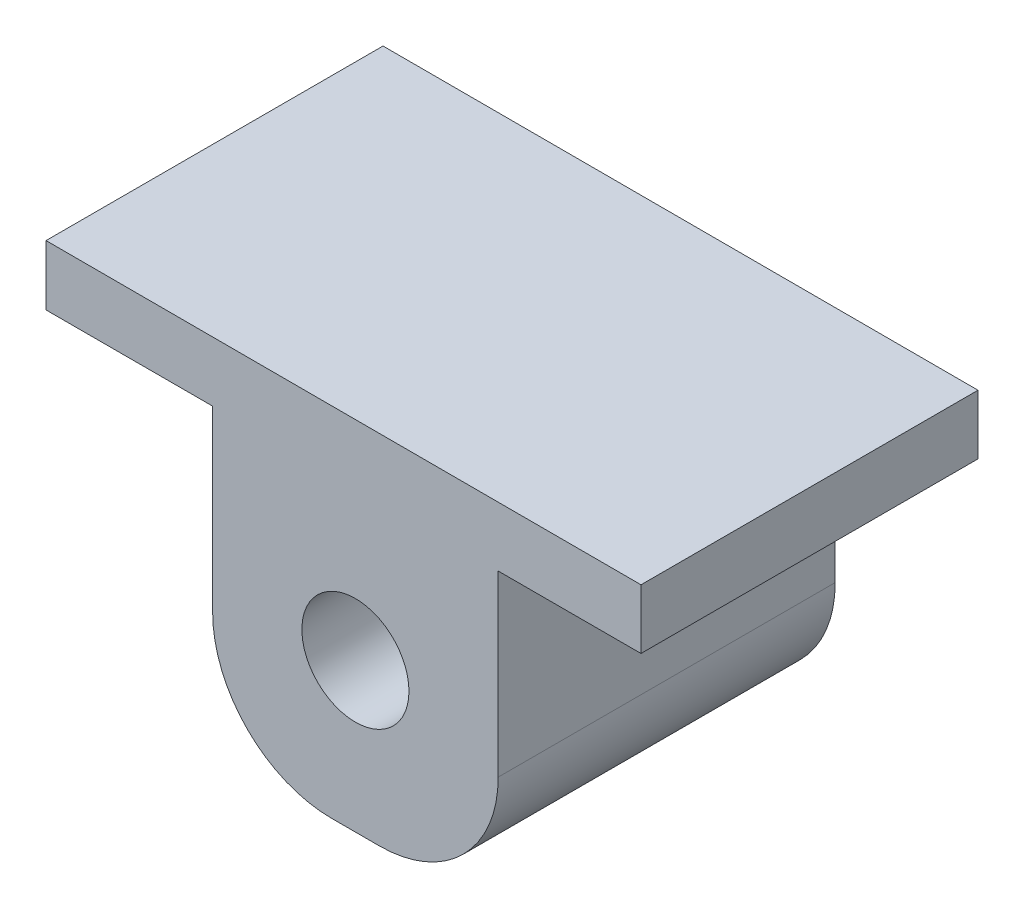
ISO-10303-21;
HEADER;
FILE_DESCRIPTION(('STEP AP214'),'2;1');
FILE_NAME('part.step','',(''),(''),'','','');
FILE_SCHEMA(('AUTOMOTIVE_DESIGN { 1 0 10303 214 1 1 1 1 }'));
ENDSEC;
DATA;
#1=APPLICATION_CONTEXT('core data for automotive mechanical design processes');
#2=APPLICATION_PROTOCOL_DEFINITION('international standard','automotive_design',2000,#1);
#3=PRODUCT_CONTEXT('',#1,'mechanical');
#4=PRODUCT('Part','Part','',(#3));
#5=PRODUCT_RELATED_PRODUCT_CATEGORY('part','',(#4));
#6=PRODUCT_DEFINITION_FORMATION('','',#4);
#7=PRODUCT_DEFINITION_CONTEXT('part definition',#1,'design');
#8=PRODUCT_DEFINITION('design','',#6,#7);
#9=PRODUCT_DEFINITION_SHAPE('','',#8);
#10=(LENGTH_UNIT() NAMED_UNIT(*) SI_UNIT(.MILLI.,.METRE.));
#11=(NAMED_UNIT(*) PLANE_ANGLE_UNIT() SI_UNIT($,.RADIAN.));
#12=(NAMED_UNIT(*) SI_UNIT($,.STERADIAN.) SOLID_ANGLE_UNIT());
#13=UNCERTAINTY_MEASURE_WITH_UNIT(LENGTH_MEASURE(1.E-05),#10,'distance_accuracy_value','');
#14=(GEOMETRIC_REPRESENTATION_CONTEXT(3) GLOBAL_UNCERTAINTY_ASSIGNED_CONTEXT((#13)) GLOBAL_UNIT_ASSIGNED_CONTEXT((#10,
#11,#12)) REPRESENTATION_CONTEXT('',''));
#15=CARTESIAN_POINT('',(0.,0.,0.));
#16=DIRECTION('',(0.,0.,1.));
#17=DIRECTION('',(1.,0.,0.));
#18=AXIS2_PLACEMENT_3D('',#15,#16,#17);
#19=CARTESIAN_POINT('',(0.,0.,28.32));
#20=DIRECTION('',(0.,0.,-1.));
#21=DIRECTION('',(-1.,0.,0.));
#22=AXIS2_PLACEMENT_3D('',#19,#20,#21);
#23=PLANE('',#22);
#24=DIRECTION('',(0.,-1.,0.));
#25=VECTOR('',#24,1.);
#26=CARTESIAN_POINT('',(14.5277983879841,-30.0449330067845,28.32));
#27=LINE('',#26,#25);
#28=CARTESIAN_POINT('',(14.5277983879841,-5.04493300678446,28.32));
#29=VERTEX_POINT('',#28);
#30=CARTESIAN_POINT('',(14.5277983879841,-20.0449330067845,28.32));
#31=VERTEX_POINT('',#30);
#32=EDGE_CURVE('E133',#29,#31,#27,.T.);
#33=ORIENTED_EDGE('',*,*,#32,.T.);
#34=CARTESIAN_POINT('',(24.5277983879841,-20.0449330067845,28.32));
#35=DIRECTION('',(0.,0.,-1.));
#36=DIRECTION('',(-1.,0.,0.));
#37=AXIS2_PLACEMENT_3D('',#34,#35,#36);
#38=CIRCLE('',#37,10.);
#39=CARTESIAN_POINT('',(24.5277983879841,-30.0449330067845,28.32));
#40=VERTEX_POINT('',#39);
#41=EDGE_CURVE('E52',#31,#40,#38,.F.);
#42=ORIENTED_EDGE('',*,*,#41,.T.);
#43=DIRECTION('',(1.,0.,0.));
#44=VECTOR('',#43,1.);
#45=CARTESIAN_POINT('',(38.5277983879841,-30.0449330067845,28.32));
#46=LINE('',#45,#44);
#47=CARTESIAN_POINT('',(28.5277983879841,-30.0449330067845,28.32));
#48=VERTEX_POINT('',#47);
#49=EDGE_CURVE('E175',#40,#48,#46,.T.);
#50=ORIENTED_EDGE('',*,*,#49,.T.);
#51=CARTESIAN_POINT('',(28.5277983879841,-20.0449330067845,28.32));
#52=DIRECTION('',(0.,0.,-1.));
#53=DIRECTION('',(-1.,0.,0.));
#54=AXIS2_PLACEMENT_3D('',#51,#52,#53);
#55=CIRCLE('',#54,10.);
#56=CARTESIAN_POINT('',(38.5277983879841,-20.0449330067845,28.32));
#57=VERTEX_POINT('',#56);
#58=EDGE_CURVE('E59',#48,#57,#55,.F.);
#59=ORIENTED_EDGE('',*,*,#58,.T.);
#60=DIRECTION('',(0.,1.,0.));
#61=VECTOR('',#60,1.);
#62=CARTESIAN_POINT('',(38.5277983879841,-5.04493300678446,28.32));
#63=LINE('',#62,#61);
#64=CARTESIAN_POINT('',(38.5277983879841,-5.04493300678446,28.32));
#65=VERTEX_POINT('',#64);
#66=EDGE_CURVE('E184',#57,#65,#63,.T.);
#67=ORIENTED_EDGE('',*,*,#66,.T.);
#68=DIRECTION('',(1.,0.,0.));
#69=VECTOR('',#68,1.);
#70=CARTESIAN_POINT('',(50.5277983879841,-5.04493300678446,28.32));
#71=LINE('',#70,#69);
#72=CARTESIAN_POINT('',(50.5277983879841,-5.04493300678446,28.32));
#73=VERTEX_POINT('',#72);
#74=EDGE_CURVE('E232',#65,#73,#71,.T.);
#75=ORIENTED_EDGE('',*,*,#74,.T.);
#76=DIRECTION('',(-5.10152156768529E-06,0.999999999986987,0.));
#77=VECTOR('',#76,1.);
#78=CARTESIAN_POINT('',(50.5277728803762,-0.0449330068495192,28.32));
#79=LINE('',#78,#77);
#80=CARTESIAN_POINT('',(50.5277728803762,-0.0449330068495192,28.32));
#81=VERTEX_POINT('',#80);
#82=EDGE_CURVE('E244',#73,#81,#79,.T.);
#83=ORIENTED_EDGE('',*,*,#82,.T.);
#84=DIRECTION('',(-0.999999489847843,0.00101010101140235,0.));
#85=VECTOR('',#84,1.);
#86=CARTESIAN_POINT('',(0.527798387984074,0.00557204372059849,28.32));
#87=LINE('',#86,#85);
#88=CARTESIAN_POINT('',(0.527798387984074,0.00557204372059849,28.32));
#89=VERTEX_POINT('',#88);
#90=EDGE_CURVE('E139',#81,#89,#87,.T.);
#91=ORIENTED_EDGE('',*,*,#90,.T.);
#92=DIRECTION('',(-0.000617965823074395,-0.999999809059103,0.));
#93=VECTOR('',#92,1.);
#94=CARTESIAN_POINT('',(0.524677347877663,-5.04493300678446,28.32));
#95=LINE('',#94,#93);
#96=CARTESIAN_POINT('',(0.524677347877663,-5.04493300678446,28.32));
#97=VERTEX_POINT('',#96);
#98=EDGE_CURVE('E134',#89,#97,#95,.T.);
#99=ORIENTED_EDGE('',*,*,#98,.T.);
#100=DIRECTION('',(1.,0.,0.));
#101=VECTOR('',#100,1.);
#102=CARTESIAN_POINT('',(14.5277983879841,-5.04493300678446,28.32));
#103=LINE('',#102,#101);
#104=EDGE_CURVE('E124',#97,#29,#103,.T.);
#105=ORIENTED_EDGE('',*,*,#104,.T.);
#106=EDGE_LOOP('',(#33,#42,#50,#59,#67,#75,#83,#91,#99,#105));
#107=FACE_BOUND('',#106,.T.);
#108=CARTESIAN_POINT('',(26.5277983879841,-17.5449330067845,28.32));
#109=DIRECTION('',(0.,0.,1.));
#110=DIRECTION('',(1.,0.,0.));
#111=AXIS2_PLACEMENT_3D('',#108,#109,#110);
#112=CIRCLE('',#111,4.5);
#113=CARTESIAN_POINT('',(31.0277983879841,-17.5449330067845,28.32));
#114=VERTEX_POINT('',#113);
#115=EDGE_CURVE('E250',#114,#114,#112,.T.);
#116=ORIENTED_EDGE('',*,*,#115,.F.);
#117=EDGE_LOOP('',(#116));
#118=FACE_BOUND('',#117,.T.);
#119=ADVANCED_FACE('F43',(#107,#118),#23,.F.);
#120=CARTESIAN_POINT('',(0.,0.,0.));
#121=DIRECTION('',(0.,0.,-1.));
#122=DIRECTION('',(-1.,0.,0.));
#123=AXIS2_PLACEMENT_3D('',#120,#121,#122);
#124=PLANE('',#123);
#125=DIRECTION('',(1.,0.,0.));
#126=VECTOR('',#125,1.);
#127=CARTESIAN_POINT('',(38.5277983879841,-30.0449330067845,0.));
#128=LINE('',#127,#126);
#129=CARTESIAN_POINT('',(24.5277983879841,-30.0449330067845,0.));
#130=VERTEX_POINT('',#129);
#131=CARTESIAN_POINT('',(28.5277983879841,-30.0449330067845,0.));
#132=VERTEX_POINT('',#131);
#133=EDGE_CURVE('E192',#130,#132,#128,.T.);
#134=ORIENTED_EDGE('',*,*,#133,.F.);
#135=CARTESIAN_POINT('',(24.5277983879841,-20.0449330067845,0.));
#136=DIRECTION('',(0.,0.,-1.));
#137=DIRECTION('',(-1.,0.,0.));
#138=AXIS2_PLACEMENT_3D('',#135,#136,#137);
#139=CIRCLE('',#138,10.);
#140=CARTESIAN_POINT('',(14.5277983879841,-20.0449330067845,0.));
#141=VERTEX_POINT('',#140);
#142=EDGE_CURVE('E166',#130,#141,#139,.T.);
#143=ORIENTED_EDGE('',*,*,#142,.T.);
#144=DIRECTION('',(0.,-1.,0.));
#145=VECTOR('',#144,1.);
#146=CARTESIAN_POINT('',(14.5277983879841,-30.0449330067845,0.));
#147=LINE('',#146,#145);
#148=CARTESIAN_POINT('',(14.5277983879841,-5.04493300678446,0.));
#149=VERTEX_POINT('',#148);
#150=EDGE_CURVE('E191',#149,#141,#147,.T.);
#151=ORIENTED_EDGE('',*,*,#150,.F.);
#152=DIRECTION('',(1.,0.,0.));
#153=VECTOR('',#152,1.);
#154=CARTESIAN_POINT('',(14.5277983879841,-5.04493300678446,0.));
#155=LINE('',#154,#153);
#156=CARTESIAN_POINT('',(0.524677347877663,-5.04493300678446,0.));
#157=VERTEX_POINT('',#156);
#158=EDGE_CURVE('E195',#157,#149,#155,.T.);
#159=ORIENTED_EDGE('',*,*,#158,.F.);
#160=DIRECTION('',(-0.000617965823074395,-0.999999809059103,0.));
#161=VECTOR('',#160,1.);
#162=CARTESIAN_POINT('',(0.524677347877663,-5.04493300678446,0.));
#163=LINE('',#162,#161);
#164=CARTESIAN_POINT('',(0.527798387984074,0.00557204372059849,0.));
#165=VERTEX_POINT('',#164);
#166=EDGE_CURVE('E148',#165,#157,#163,.T.);
#167=ORIENTED_EDGE('',*,*,#166,.F.);
#168=DIRECTION('',(-0.999999489847843,0.00101010101140235,0.));
#169=VECTOR('',#168,1.);
#170=CARTESIAN_POINT('',(0.527798387984074,0.00557204372059849,0.));
#171=LINE('',#170,#169);
#172=CARTESIAN_POINT('',(50.5277728803762,-0.0449330068495192,0.));
#173=VERTEX_POINT('',#172);
#174=EDGE_CURVE('E144',#173,#165,#171,.T.);
#175=ORIENTED_EDGE('',*,*,#174,.F.);
#176=DIRECTION('',(-5.10152156768529E-06,0.999999999986987,0.));
#177=VECTOR('',#176,1.);
#178=CARTESIAN_POINT('',(50.5277728803762,-0.0449330068495192,0.));
#179=LINE('',#178,#177);
#180=CARTESIAN_POINT('',(50.5277983879841,-5.04493300678446,0.));
#181=VERTEX_POINT('',#180);
#182=EDGE_CURVE('E209',#181,#173,#179,.T.);
#183=ORIENTED_EDGE('',*,*,#182,.F.);
#184=DIRECTION('',(1.,0.,0.));
#185=VECTOR('',#184,1.);
#186=CARTESIAN_POINT('',(50.5277983879841,-5.04493300678446,0.));
#187=LINE('',#186,#185);
#188=CARTESIAN_POINT('',(38.5277983879841,-5.04493300678446,0.));
#189=VERTEX_POINT('',#188);
#190=EDGE_CURVE('E206',#189,#181,#187,.T.);
#191=ORIENTED_EDGE('',*,*,#190,.F.);
#192=DIRECTION('',(0.,1.,0.));
#193=VECTOR('',#192,1.);
#194=CARTESIAN_POINT('',(38.5277983879841,-5.04493300678446,0.));
#195=LINE('',#194,#193);
#196=CARTESIAN_POINT('',(38.5277983879841,-20.0449330067845,0.));
#197=VERTEX_POINT('',#196);
#198=EDGE_CURVE('E199',#197,#189,#195,.T.);
#199=ORIENTED_EDGE('',*,*,#198,.F.);
#200=CARTESIAN_POINT('',(28.5277983879841,-20.0449330067845,0.));
#201=DIRECTION('',(0.,0.,-1.));
#202=DIRECTION('',(-1.,0.,0.));
#203=AXIS2_PLACEMENT_3D('',#200,#201,#202);
#204=CIRCLE('',#203,10.);
#205=EDGE_CURVE('E163',#197,#132,#204,.T.);
#206=ORIENTED_EDGE('',*,*,#205,.T.);
#207=EDGE_LOOP('',(#134,#143,#151,#159,#167,#175,#183,#191,#199,#206));
#208=FACE_BOUND('',#207,.T.);
#209=CARTESIAN_POINT('',(26.5277983879841,-17.5449330067845,0.));
#210=DIRECTION('',(0.,0.,1.));
#211=DIRECTION('',(1.,0.,0.));
#212=AXIS2_PLACEMENT_3D('',#209,#210,#211);
#213=CIRCLE('',#212,4.5);
#214=CARTESIAN_POINT('',(31.0277983879841,-17.5449330067845,0.));
#215=VERTEX_POINT('',#214);
#216=EDGE_CURVE('E253',#215,#215,#213,.T.);
#217=ORIENTED_EDGE('',*,*,#216,.T.);
#218=EDGE_LOOP('',(#217));
#219=FACE_BOUND('',#218,.T.);
#220=ADVANCED_FACE('F189',(#208,#219),#124,.T.);
#221=CARTESIAN_POINT('',(0.524677347877663,-5.04493300678446,28.32));
#222=DIRECTION('',(0.999999809059103,-0.000617965823074395,0.));
#223=DIRECTION('',(0.000617965823074395,0.999999809059103,0.));
#224=AXIS2_PLACEMENT_3D('',#221,#222,#223);
#225=PLANE('',#224);
#226=ORIENTED_EDGE('',*,*,#166,.T.);
#227=DIRECTION('',(0.,0.,-1.));
#228=VECTOR('',#227,1.);
#229=CARTESIAN_POINT('',(0.524677347877663,-5.04493300678446,28.32));
#230=LINE('',#229,#228);
#231=EDGE_CURVE('E128',#97,#157,#230,.T.);
#232=ORIENTED_EDGE('',*,*,#231,.F.);
#233=ORIENTED_EDGE('',*,*,#98,.F.);
#234=DIRECTION('',(0.,0.,-1.));
#235=VECTOR('',#234,1.);
#236=CARTESIAN_POINT('',(0.527798387984074,0.00557204372059849,28.32));
#237=LINE('',#236,#235);
#238=EDGE_CURVE('E214',#89,#165,#237,.T.);
#239=ORIENTED_EDGE('',*,*,#238,.T.);
#240=EDGE_LOOP('',(#226,#232,#233,#239));
#241=FACE_BOUND('',#240,.T.);
#242=ADVANCED_FACE('F146',(#241),#225,.F.);
#243=CARTESIAN_POINT('',(14.5277983879841,-5.04493300678446,28.32));
#244=DIRECTION('',(0.,1.,0.));
#245=DIRECTION('',(-1.,0.,0.));
#246=AXIS2_PLACEMENT_3D('',#243,#244,#245);
#247=PLANE('',#246);
#248=ORIENTED_EDGE('',*,*,#158,.T.);
#249=DIRECTION('',(0.,0.,-1.));
#250=VECTOR('',#249,1.);
#251=CARTESIAN_POINT('',(14.5277983879841,-5.04493300678446,28.32));
#252=LINE('',#251,#250);
#253=EDGE_CURVE('E131',#29,#149,#252,.T.);
#254=ORIENTED_EDGE('',*,*,#253,.F.);
#255=ORIENTED_EDGE('',*,*,#104,.F.);
#256=ORIENTED_EDGE('',*,*,#231,.T.);
#257=EDGE_LOOP('',(#248,#254,#255,#256));
#258=FACE_BOUND('',#257,.T.);
#259=ADVANCED_FACE('F126',(#258),#247,.F.);
#260=CARTESIAN_POINT('',(14.5277983879841,-30.0449330067845,28.32));
#261=DIRECTION('',(1.,0.,0.));
#262=DIRECTION('',(0.,1.,0.));
#263=AXIS2_PLACEMENT_3D('',#260,#261,#262);
#264=PLANE('',#263);
#265=ORIENTED_EDGE('',*,*,#150,.T.);
#266=DIRECTION('',(0.,0.,-1.));
#267=VECTOR('',#266,1.);
#268=CARTESIAN_POINT('',(14.5277983879841,-20.0449330067845,28.32));
#269=LINE('',#268,#267);
#270=EDGE_CURVE('E67',#141,#31,#269,.F.);
#271=ORIENTED_EDGE('',*,*,#270,.T.);
#272=ORIENTED_EDGE('',*,*,#32,.F.);
#273=ORIENTED_EDGE('',*,*,#253,.T.);
#274=EDGE_LOOP('',(#265,#271,#272,#273));
#275=FACE_BOUND('',#274,.T.);
#276=ADVANCED_FACE('F193',(#275),#264,.F.);
#277=CARTESIAN_POINT('',(38.5277983879841,-30.0449330067845,28.32));
#278=DIRECTION('',(0.,1.,0.));
#279=DIRECTION('',(-1.,0.,0.));
#280=AXIS2_PLACEMENT_3D('',#277,#278,#279);
#281=PLANE('',#280);
#282=ORIENTED_EDGE('',*,*,#49,.F.);
#283=DIRECTION('',(0.,0.,-1.));
#284=VECTOR('',#283,1.);
#285=CARTESIAN_POINT('',(24.5277983879841,-30.0449330067845,28.32));
#286=LINE('',#285,#284);
#287=EDGE_CURVE('E154',#40,#130,#286,.T.);
#288=ORIENTED_EDGE('',*,*,#287,.T.);
#289=ORIENTED_EDGE('',*,*,#133,.T.);
#290=DIRECTION('',(0.,0.,-1.));
#291=VECTOR('',#290,1.);
#292=CARTESIAN_POINT('',(28.5277983879841,-30.0449330067845,28.32));
#293=LINE('',#292,#291);
#294=EDGE_CURVE('E150',#132,#48,#293,.F.);
#295=ORIENTED_EDGE('',*,*,#294,.T.);
#296=EDGE_LOOP('',(#282,#288,#289,#295));
#297=FACE_BOUND('',#296,.T.);
#298=ADVANCED_FACE('F179',(#297),#281,.F.);
#299=CARTESIAN_POINT('',(38.5277983879841,-5.04493300678446,28.32));
#300=DIRECTION('',(-1.,0.,0.));
#301=DIRECTION('',(0.,-1.,0.));
#302=AXIS2_PLACEMENT_3D('',#299,#300,#301);
#303=PLANE('',#302);
#304=ORIENTED_EDGE('',*,*,#66,.F.);
#305=DIRECTION('',(0.,0.,-1.));
#306=VECTOR('',#305,1.);
#307=CARTESIAN_POINT('',(38.5277983879841,-20.0449330067845,28.32));
#308=LINE('',#307,#306);
#309=EDGE_CURVE('E11',#57,#197,#308,.T.);
#310=ORIENTED_EDGE('',*,*,#309,.T.);
#311=ORIENTED_EDGE('',*,*,#198,.T.);
#312=DIRECTION('',(0.,0.,-1.));
#313=VECTOR('',#312,1.);
#314=CARTESIAN_POINT('',(38.5277983879841,-5.04493300678446,28.32));
#315=LINE('',#314,#313);
#316=EDGE_CURVE('E156',#65,#189,#315,.T.);
#317=ORIENTED_EDGE('',*,*,#316,.F.);
#318=EDGE_LOOP('',(#304,#310,#311,#317));
#319=FACE_BOUND('',#318,.T.);
#320=ADVANCED_FACE('F266',(#319),#303,.F.);
#321=CARTESIAN_POINT('',(50.5277983879841,-5.04493300678446,28.32));
#322=DIRECTION('',(0.,1.,0.));
#323=DIRECTION('',(-1.,0.,0.));
#324=AXIS2_PLACEMENT_3D('',#321,#322,#323);
#325=PLANE('',#324);
#326=ORIENTED_EDGE('',*,*,#190,.T.);
#327=DIRECTION('',(0.,0.,-1.));
#328=VECTOR('',#327,1.);
#329=CARTESIAN_POINT('',(50.5277983879841,-5.04493300678446,28.32));
#330=LINE('',#329,#328);
#331=EDGE_CURVE('E221',#73,#181,#330,.T.);
#332=ORIENTED_EDGE('',*,*,#331,.F.);
#333=ORIENTED_EDGE('',*,*,#74,.F.);
#334=ORIENTED_EDGE('',*,*,#316,.T.);
#335=EDGE_LOOP('',(#326,#332,#333,#334));
#336=FACE_BOUND('',#335,.T.);
#337=ADVANCED_FACE('F230',(#336),#325,.F.);
#338=CARTESIAN_POINT('',(50.5277728803762,-0.0449330068495192,28.32));
#339=DIRECTION('',(-0.999999999986987,-5.10152156768529E-06,0.));
#340=DIRECTION('',(5.10152156768529E-06,-0.999999999986987,0.));
#341=AXIS2_PLACEMENT_3D('',#338,#339,#340);
#342=PLANE('',#341);
#343=ORIENTED_EDGE('',*,*,#182,.T.);
#344=DIRECTION('',(0.,0.,-1.));
#345=VECTOR('',#344,1.);
#346=CARTESIAN_POINT('',(50.5277728803762,-0.0449330068495192,28.32));
#347=LINE('',#346,#345);
#348=EDGE_CURVE('E217',#81,#173,#347,.T.);
#349=ORIENTED_EDGE('',*,*,#348,.F.);
#350=ORIENTED_EDGE('',*,*,#82,.F.);
#351=ORIENTED_EDGE('',*,*,#331,.T.);
#352=EDGE_LOOP('',(#343,#349,#350,#351));
#353=FACE_BOUND('',#352,.T.);
#354=ADVANCED_FACE('F239',(#353),#342,.F.);
#355=CARTESIAN_POINT('',(0.527798387984074,0.00557204372059849,28.32));
#356=DIRECTION('',(-0.00101010101140235,-0.999999489847843,0.));
#357=DIRECTION('',(0.999999489847843,-0.00101010101140235,0.));
#358=AXIS2_PLACEMENT_3D('',#355,#356,#357);
#359=PLANE('',#358);
#360=ORIENTED_EDGE('',*,*,#174,.T.);
#361=ORIENTED_EDGE('',*,*,#238,.F.);
#362=ORIENTED_EDGE('',*,*,#90,.F.);
#363=ORIENTED_EDGE('',*,*,#348,.T.);
#364=EDGE_LOOP('',(#360,#361,#362,#363));
#365=FACE_BOUND('',#364,.T.);
#366=ADVANCED_FACE('F242',(#365),#359,.F.);
#367=CARTESIAN_POINT('',(26.5277983879841,-17.5449330067845,28.32));
#368=DIRECTION('',(0.,0.,-1.));
#369=DIRECTION('',(-1.,0.,0.));
#370=AXIS2_PLACEMENT_3D('',#367,#368,#369);
#371=CYLINDRICAL_SURFACE('',#370,4.5);
#372=ORIENTED_EDGE('',*,*,#115,.T.);
#373=EDGE_LOOP('',(#372));
#374=FACE_BOUND('',#373,.T.);
#375=ORIENTED_EDGE('',*,*,#216,.F.);
#376=EDGE_LOOP('',(#375));
#377=FACE_BOUND('',#376,.T.);
#378=ADVANCED_FACE('F272',(#374,#377),#371,.F.);
#379=CARTESIAN_POINT('',(24.5277983879841,-20.0449330067845,28.32));
#380=DIRECTION('',(0.,0.,-1.));
#381=DIRECTION('',(-1.,0.,0.));
#382=AXIS2_PLACEMENT_3D('',#379,#380,#381);
#383=CYLINDRICAL_SURFACE('',#382,10.);
#384=ORIENTED_EDGE('',*,*,#41,.F.);
#385=ORIENTED_EDGE('',*,*,#270,.F.);
#386=ORIENTED_EDGE('',*,*,#142,.F.);
#387=ORIENTED_EDGE('',*,*,#287,.F.);
#388=EDGE_LOOP('',(#384,#385,#386,#387));
#389=FACE_BOUND('',#388,.T.);
#390=ADVANCED_FACE('F186',(#389),#383,.T.);
#391=CARTESIAN_POINT('',(28.5277983879841,-20.0449330067845,28.32));
#392=DIRECTION('',(0.,0.,-1.));
#393=DIRECTION('',(-1.,0.,0.));
#394=AXIS2_PLACEMENT_3D('',#391,#392,#393);
#395=CYLINDRICAL_SURFACE('',#394,10.);
#396=ORIENTED_EDGE('',*,*,#58,.F.);
#397=ORIENTED_EDGE('',*,*,#294,.F.);
#398=ORIENTED_EDGE('',*,*,#205,.F.);
#399=ORIENTED_EDGE('',*,*,#309,.F.);
#400=EDGE_LOOP('',(#396,#397,#398,#399));
#401=FACE_BOUND('',#400,.T.);
#402=ADVANCED_FACE('F45',(#401),#395,.T.);
#403=CLOSED_SHELL('',(#119,#220,#242,#259,#276,#298,#320,#337,#354,#366,#378,#390,#402));
#404=MANIFOLD_SOLID_BREP('B2',#403);
#405=ADVANCED_BREP_SHAPE_REPRESENTATION('',(#18,#404),#14);
#406=SHAPE_DEFINITION_REPRESENTATION(#9,#405);
ENDSEC;
END-ISO-10303-21;
